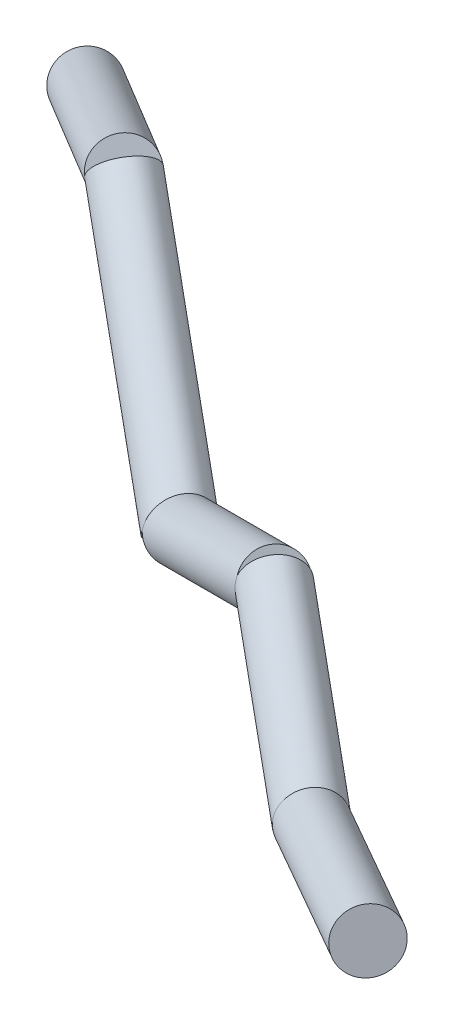
ISO-10303-21;
HEADER;
FILE_DESCRIPTION(('STEP AP214'),'2;1');
FILE_NAME('part.step','',(''),(''),'','','');
FILE_SCHEMA(('AUTOMOTIVE_DESIGN { 1 0 10303 214 1 1 1 1 }'));
ENDSEC;
DATA;
#1=APPLICATION_CONTEXT('core data for automotive mechanical design processes');
#2=APPLICATION_PROTOCOL_DEFINITION('international standard','automotive_design',2000,#1);
#3=PRODUCT_CONTEXT('',#1,'mechanical');
#4=PRODUCT('Part','Part','',(#3));
#5=PRODUCT_RELATED_PRODUCT_CATEGORY('part','',(#4));
#6=PRODUCT_DEFINITION_FORMATION('','',#4);
#7=PRODUCT_DEFINITION_CONTEXT('part definition',#1,'design');
#8=PRODUCT_DEFINITION('design','',#6,#7);
#9=PRODUCT_DEFINITION_SHAPE('','',#8);
#10=(LENGTH_UNIT() NAMED_UNIT(*) SI_UNIT(.MILLI.,.METRE.));
#11=(NAMED_UNIT(*) PLANE_ANGLE_UNIT() SI_UNIT($,.RADIAN.));
#12=(NAMED_UNIT(*) SI_UNIT($,.STERADIAN.) SOLID_ANGLE_UNIT());
#13=UNCERTAINTY_MEASURE_WITH_UNIT(LENGTH_MEASURE(1.E-05),#10,'distance_accuracy_value','');
#14=(GEOMETRIC_REPRESENTATION_CONTEXT(3) GLOBAL_UNCERTAINTY_ASSIGNED_CONTEXT((#13)) GLOBAL_UNIT_ASSIGNED_CONTEXT((#10,
#11,#12)) REPRESENTATION_CONTEXT('',''));
#15=CARTESIAN_POINT('',(0.,0.,0.));
#16=DIRECTION('',(0.,0.,1.));
#17=DIRECTION('',(1.,0.,0.));
#18=AXIS2_PLACEMENT_3D('',#15,#16,#17);
#19=CARTESIAN_POINT('',(0.,0.,0.));
#20=DIRECTION('',(0.727392967452922,0.363696483726961,0.581914373962938));
#21=DIRECTION('',(0.,-0.847998304005006,0.529998940003311));
#22=AXIS2_PLACEMENT_3D('',#19,#20,#21);
#23=PLANE('',#22);
#24=CARTESIAN_POINT('',(0.,0.,0.));
#25=DIRECTION('',(0.727392967453219,0.363696483726886,0.581914373962612));
#26=DIRECTION('',(0.665531499170195,-0.167234250415049,-0.727392967453213));
#27=AXIS2_PLACEMENT_3D('',#24,#25,#26);
#28=CIRCLE('',#27,15.);
#29=CARTESIAN_POINT('',(9.982972487552,-2.508513756224,-10.9108945118));
#30=VERTEX_POINT('',#29);
#31=EDGE_CURVE('E10',#30,#30,#28,.T.);
#32=ORIENTED_EDGE('',*,*,#31,.F.);
#33=EDGE_LOOP('',(#32));
#34=FACE_BOUND('',#33,.T.);
#35=ADVANCED_FACE('F16',(#34),#23,.F.);
#36=CARTESIAN_POINT('',(100.,50.,80.));
#37=DIRECTION('',(0.727392967452922,0.363696483726961,0.581914373962938));
#38=DIRECTION('',(0.,-0.847998304005006,0.529998940003311));
#39=AXIS2_PLACEMENT_3D('',#36,#37,#38);
#40=PLANE('',#39);
#41=DIRECTION('',(0.604727467440112,0.0610835825697213,-0.794086573406147));
#42=VECTOR('',#41,1.);
#43=CARTESIAN_POINT('',(100.,50.,80.));
#44=LINE('',#43,#42);
#45=CARTESIAN_POINT('',(90.929087988399,49.083746261454,91.911298601093));
#46=VERTEX_POINT('',#45);
#47=CARTESIAN_POINT('',(109.0709120116,50.916253738546,68.088701398907));
#48=VERTEX_POINT('',#47);
#49=EDGE_CURVE('E116',#46,#48,#44,.T.);
#50=ORIENTED_EDGE('',*,*,#49,.T.);
#51=CARTESIAN_POINT('',(100.,50.,80.));
#52=DIRECTION('',(0.727392967453219,0.363696483726886,0.581914373962612));
#53=DIRECTION('',(0.665531499170195,-0.167234250415049,-0.727392967453213));
#54=AXIS2_PLACEMENT_3D('',#51,#52,#53);
#55=CIRCLE('',#54,15.);
#56=EDGE_CURVE('E105',#48,#46,#55,.T.);
#57=ORIENTED_EDGE('',*,*,#56,.T.);
#58=EDGE_LOOP('',(#50,#57));
#59=FACE_BOUND('',#58,.T.);
#60=ADVANCED_FACE('F18',(#59),#40,.T.);
#61=CARTESIAN_POINT('',(0.,0.,0.));
#62=DIRECTION('',(0.727392967453219,0.363696483726886,0.581914373962612));
#63=DIRECTION('',(0.665531499170195,-0.167234250415049,-0.727392967453213));
#64=AXIS2_PLACEMENT_3D('',#61,#62,#63);
#65=CYLINDRICAL_SURFACE('',#64,15.);
#66=ORIENTED_EDGE('',*,*,#56,.F.);
#67=CARTESIAN_POINT('',(100.,50.,80.));
#68=DIRECTION('',(0.795105990127859,-0.103824697432432,0.597517277294859));
#69=DIRECTION('',(0.045947302274389,0.992718101045546,0.111353568735949));
#70=AXIS2_PLACEMENT_3D('',#67,#68,#69);
#71=ELLIPSE('',#70,16.886230430054,15.);
#72=CARTESIAN_POINT('',(108.60849765436,46.804248827181,67.989525621649));
#73=VERTEX_POINT('',#72);
#74=EDGE_CURVE('E109',#73,#48,#71,.T.);
#75=ORIENTED_EDGE('',*,*,#74,.F.);
#76=DIRECTION('',(0.727392967452922,0.363696483726961,0.581914373962938));
#77=VECTOR('',#76,1.);
#78=CARTESIAN_POINT('',(9.982972487552,-2.508513756224,-10.9108945118));
#79=LINE('',#78,#77);
#80=EDGE_CURVE('E25',#30,#73,#79,.T.);
#81=ORIENTED_EDGE('',*,*,#80,.F.);
#82=ORIENTED_EDGE('',*,*,#31,.T.);
#83=ORIENTED_EDGE('',*,*,#80,.T.);
#84=CARTESIAN_POINT('',(100.,50.,80.));
#85=DIRECTION('',(0.795105990127859,-0.103824697432432,0.597517277294859));
#86=DIRECTION('',(0.045947302274389,0.992718101045546,0.111353568735949));
#87=AXIS2_PLACEMENT_3D('',#84,#85,#86);
#88=ELLIPSE('',#87,16.886230430054,15.);
#89=EDGE_CURVE('E111',#46,#73,#88,.T.);
#90=ORIENTED_EDGE('',*,*,#89,.F.);
#91=EDGE_LOOP('',(#66,#75,#81,#82,#83,#90));
#92=FACE_BOUND('',#91,.T.);
#93=ADVANCED_FACE('F107',(#92),#65,.T.);
#94=CARTESIAN_POINT('',(100.,50.,80.));
#95=DIRECTION('',(0.685188709827879,-0.548150967861903,0.479632096878915));
#96=DIRECTION('',(0.,-0.658504607868324,-0.752576694707048));
#97=AXIS2_PLACEMENT_3D('',#94,#95,#96);
#98=PLANE('',#97);
#99=ORIENTED_EDGE('',*,*,#49,.F.);
#100=CARTESIAN_POINT('',(100.,50.,80.));
#101=DIRECTION('',(0.685188709827623,-0.548150967861999,0.479632096879173));
#102=DIRECTION('',(0.682702498096889,0.253838001521958,-0.685188709827888));
#103=AXIS2_PLACEMENT_3D('',#100,#101,#102);
#104=CIRCLE('',#103,15.);
#105=CARTESIAN_POINT('',(110.24053747145,53.807570022835,69.722169352587));
#106=VERTEX_POINT('',#105);
#107=EDGE_CURVE('E128',#106,#46,#104,.T.);
#108=ORIENTED_EDGE('',*,*,#107,.F.);
#109=CARTESIAN_POINT('',(100.,50.,80.));
#110=DIRECTION('',(0.685188709827623,-0.548150967861999,0.479632096879173));
#111=DIRECTION('',(0.682702498096889,0.253838001521958,-0.685188709827888));
#112=AXIS2_PLACEMENT_3D('',#109,#110,#111);
#113=CIRCLE('',#112,15.);
#114=EDGE_CURVE('E124',#48,#106,#113,.T.);
#115=ORIENTED_EDGE('',*,*,#114,.F.);
#116=EDGE_LOOP('',(#99,#108,#115));
#117=FACE_BOUND('',#116,.T.);
#118=ADVANCED_FACE('F127',(#117),#98,.F.);
#119=CARTESIAN_POINT('',(200.,-30.,150.));
#120=DIRECTION('',(0.685188709827879,-0.548150967861903,0.479632096878915));
#121=DIRECTION('',(0.,-0.658504607868324,-0.752576694707048));
#122=AXIS2_PLACEMENT_3D('',#119,#120,#121);
#123=PLANE('',#122);
#124=DIRECTION('',(-0.495343640012942,0.132091637336984,0.858595642688899));
#125=VECTOR('',#124,1.);
#126=CARTESIAN_POINT('',(200.,-30.,150.));
#127=LINE('',#126,#125);
#128=CARTESIAN_POINT('',(207.43015460019,-31.98137456005,137.12106535966));
#129=VERTEX_POINT('',#128);
#130=CARTESIAN_POINT('',(192.5698453998,-28.01862543994,162.87893464033));
#131=VERTEX_POINT('',#130);
#132=EDGE_CURVE('E132',#129,#131,#127,.T.);
#133=ORIENTED_EDGE('',*,*,#132,.T.);
#134=CARTESIAN_POINT('',(200.,-30.,150.));
#135=DIRECTION('',(0.685188709827623,-0.548150967861999,0.479632096879173));
#136=DIRECTION('',(0.682702498096889,0.253838001521958,-0.685188709827888));
#137=AXIS2_PLACEMENT_3D('',#134,#135,#136);
#138=CIRCLE('',#137,15.);
#139=EDGE_CURVE('E138',#131,#129,#138,.T.);
#140=ORIENTED_EDGE('',*,*,#139,.T.);
#141=EDGE_LOOP('',(#133,#140));
#142=FACE_BOUND('',#141,.T.);
#143=ADVANCED_FACE('F234',(#142),#123,.T.);
#144=CARTESIAN_POINT('',(100.,50.,80.));
#145=DIRECTION('',(0.685188709827623,-0.548150967861999,0.479632096879173));
#146=DIRECTION('',(0.682702498096889,0.253838001521958,-0.685188709827888));
#147=AXIS2_PLACEMENT_3D('',#144,#145,#146);
#148=CYLINDRICAL_SURFACE('',#147,15.);
#149=ORIENTED_EDGE('',*,*,#114,.T.);
#150=DIRECTION('',(0.685188709827879,-0.548150967861903,0.479632096878915));
#151=VECTOR('',#150,1.);
#152=CARTESIAN_POINT('',(110.24053747145,53.807570022835,69.722169352587));
#153=LINE('',#152,#151);
#154=CARTESIAN_POINT('',(207.68144376952,-24.14515501562,137.93080376123));
#155=VERTEX_POINT('',#154);
#156=EDGE_CURVE('E131',#106,#155,#153,.T.);
#157=ORIENTED_EDGE('',*,*,#156,.T.);
#158=CARTESIAN_POINT('',(200.,-30.,150.));
#159=DIRECTION('',(0.858041014444336,-0.0799383439243754,0.50732186893723));
#160=DIRECTION('',(-0.135647690101975,-0.988008937467816,0.0737430922440662));
#161=AXIS2_PLACEMENT_3D('',#158,#159,#160);
#162=ELLIPSE('',#161,17.141561279053,15.);
#163=EDGE_CURVE('E341',#129,#155,#162,.T.);
#164=ORIENTED_EDGE('',*,*,#163,.F.);
#165=ORIENTED_EDGE('',*,*,#139,.F.);
#166=CARTESIAN_POINT('',(200.,-30.,150.));
#167=DIRECTION('',(0.858041014444336,-0.0799383439243754,0.50732186893723));
#168=DIRECTION('',(-0.135647690101975,-0.988008937467816,0.0737430922440662));
#169=AXIS2_PLACEMENT_3D('',#166,#167,#168);
#170=ELLIPSE('',#169,17.141561279053,15.);
#171=EDGE_CURVE('E375',#155,#131,#170,.T.);
#172=ORIENTED_EDGE('',*,*,#171,.F.);
#173=ORIENTED_EDGE('',*,*,#156,.F.);
#174=ORIENTED_EDGE('',*,*,#107,.T.);
#175=ORIENTED_EDGE('',*,*,#89,.T.);
#176=ORIENTED_EDGE('',*,*,#74,.T.);
#177=EDGE_LOOP('',(#149,#157,#164,#165,#172,#173,#174,#175,#176));
#178=FACE_BOUND('',#177,.T.);
#179=ADVANCED_FACE('F123',(#178),#148,.T.);
#180=CARTESIAN_POINT('',(200.,-30.,150.));
#181=DIRECTION('',(0.816496580927726,0.408248290463863,0.408248290463863));
#182=DIRECTION('',(0.,0.707106781186548,-0.707106781186548));
#183=AXIS2_PLACEMENT_3D('',#180,#181,#182);
#184=PLANE('',#183);
#185=ORIENTED_EDGE('',*,*,#132,.F.);
#186=CARTESIAN_POINT('',(200.,-30.,150.));
#187=DIRECTION('',(0.816496580927726,0.408248290463863,0.408248290463863));
#188=DIRECTION('',(0.526598632370964,-0.236700683813984,-0.816496580927944));
#189=AXIS2_PLACEMENT_3D('',#186,#187,#188);
#190=CIRCLE('',#189,15.);
#191=CARTESIAN_POINT('',(207.89897948556,-33.55051025721,137.75255128608));
#192=VERTEX_POINT('',#191);
#193=EDGE_CURVE('E319',#192,#129,#190,.T.);
#194=ORIENTED_EDGE('',*,*,#193,.F.);
#195=CARTESIAN_POINT('',(200.,-30.,150.));
#196=DIRECTION('',(0.816496580927726,0.408248290463863,0.408248290463863));
#197=DIRECTION('',(0.526598632370964,-0.236700683813984,-0.816496580927944));
#198=AXIS2_PLACEMENT_3D('',#195,#196,#197);
#199=CIRCLE('',#198,15.);
#200=EDGE_CURVE('E310',#131,#192,#199,.T.);
#201=ORIENTED_EDGE('',*,*,#200,.F.);
#202=EDGE_LOOP('',(#185,#194,#201));
#203=FACE_BOUND('',#202,.T.);
#204=ADVANCED_FACE('F251',(#203),#184,.F.);
#205=CARTESIAN_POINT('',(300.,20.,200.));
#206=DIRECTION('',(0.816496580927726,0.408248290463863,0.408248290463863));
#207=DIRECTION('',(0.,0.707106781186548,-0.707106781186548));
#208=AXIS2_PLACEMENT_3D('',#205,#206,#207);
#209=PLANE('',#208);
#210=CARTESIAN_POINT('',(300.,20.,200.));
#211=DIRECTION('',(0.816496580927726,0.408248290463863,0.408248290463863));
#212=DIRECTION('',(0.526598632370964,-0.236700683813984,-0.816496580927944));
#213=AXIS2_PLACEMENT_3D('',#210,#211,#212);
#214=CIRCLE('',#213,15.);
#215=CARTESIAN_POINT('',(308.23231949922,15.060608300463,188.47475270108));
#216=VERTEX_POINT('',#215);
#217=CARTESIAN_POINT('',(307.89897948556,16.449489742783,187.75255128608));
#218=VERTEX_POINT('',#217);
#219=EDGE_CURVE('E141',#216,#218,#214,.T.);
#220=ORIENTED_EDGE('',*,*,#219,.T.);
#221=CARTESIAN_POINT('',(300.,20.,200.));
#222=DIRECTION('',(0.816496580927726,0.408248290463863,0.408248290463863));
#223=DIRECTION('',(0.526598632370964,-0.236700683813984,-0.816496580927944));
#224=AXIS2_PLACEMENT_3D('',#221,#222,#223);
#225=CIRCLE('',#224,15.);
#226=CARTESIAN_POINT('',(291.76768050077,24.939391699536,211.52524729891));
#227=VERTEX_POINT('',#226);
#228=EDGE_CURVE('E304',#218,#227,#225,.T.);
#229=ORIENTED_EDGE('',*,*,#228,.T.);
#230=DIRECTION('',(0.548821299948078,-0.329292779969047,-0.76834981992811));
#231=VECTOR('',#230,1.);
#232=CARTESIAN_POINT('',(300.,20.,200.));
#233=LINE('',#232,#231);
#234=EDGE_CURVE('E306',#227,#216,#233,.T.);
#235=ORIENTED_EDGE('',*,*,#234,.T.);
#236=EDGE_LOOP('',(#220,#229,#235));
#237=FACE_BOUND('',#236,.T.);
#238=ADVANCED_FACE('F206',(#237),#209,.T.);
#239=CARTESIAN_POINT('',(400.,0.,280.));
#240=DIRECTION('',(0.77151674981046,-0.154303349962092,0.617213399848368));
#241=DIRECTION('',(0.,-0.970142500145332,-0.242535625036333));
#242=AXIS2_PLACEMENT_3D('',#239,#240,#241);
#243=PLANE('',#242);
#244=DIRECTION('',(-0.597555190536099,0.157251365931026,0.786256829653131));
#245=VECTOR('',#244,1.);
#246=CARTESIAN_POINT('',(400.,0.,280.));
#247=LINE('',#246,#245);
#248=CARTESIAN_POINT('',(408.96332785804,-2.358770488958,268.2061475552));
#249=VERTEX_POINT('',#248);
#250=CARTESIAN_POINT('',(391.03667214195,2.358770488958,291.79385244479));
#251=VERTEX_POINT('',#250);
#252=EDGE_CURVE('E328',#249,#251,#247,.T.);
#253=ORIENTED_EDGE('',*,*,#252,.T.);
#254=CARTESIAN_POINT('',(400.,0.,280.));
#255=DIRECTION('',(0.771516749810115,-0.154303349962132,0.617213399848788));
#256=DIRECTION('',(0.631935961393089,0.0736128077214803,-0.771516749810108));
#257=AXIS2_PLACEMENT_3D('',#254,#255,#256);
#258=CIRCLE('',#257,15.);
#259=EDGE_CURVE('E351',#251,#249,#258,.T.);
#260=ORIENTED_EDGE('',*,*,#259,.T.);
#261=EDGE_LOOP('',(#253,#260));
#262=FACE_BOUND('',#261,.T.);
#263=ADVANCED_FACE('F201',(#262),#243,.T.);
#264=CARTESIAN_POINT('',(200.,-30.,150.));
#265=DIRECTION('',(0.816496580927726,0.408248290463863,0.408248290463863));
#266=DIRECTION('',(0.526598632370964,-0.236700683813984,-0.816496580927944));
#267=AXIS2_PLACEMENT_3D('',#264,#265,#266);
#268=CYLINDRICAL_SURFACE('',#267,15.);
#269=ORIENTED_EDGE('',*,*,#228,.F.);
#270=DIRECTION('',(0.816496580927726,0.408248290463863,0.408248290463863));
#271=VECTOR('',#270,1.);
#272=CARTESIAN_POINT('',(207.89897948556,-33.55051025721,137.75255128608));
#273=LINE('',#272,#271);
#274=EDGE_CURVE('E313',#192,#218,#273,.T.);
#275=ORIENTED_EDGE('',*,*,#274,.F.);
#276=ORIENTED_EDGE('',*,*,#193,.T.);
#277=ORIENTED_EDGE('',*,*,#163,.T.);
#278=ORIENTED_EDGE('',*,*,#171,.T.);
#279=ORIENTED_EDGE('',*,*,#200,.T.);
#280=ORIENTED_EDGE('',*,*,#274,.T.);
#281=ORIENTED_EDGE('',*,*,#219,.F.);
#282=CARTESIAN_POINT('',(300.,20.,200.));
#283=DIRECTION('',(0.832591524779573,0.133142714314574,0.537647068707878));
#284=DIRECTION('',(0.0747431173285436,0.93479371129967,-0.347237935321878));
#285=AXIS2_PLACEMENT_3D('',#282,#283,#284);
#286=ELLIPSE('',#285,15.728926993188,15.);
#287=EDGE_CURVE('E321',#227,#216,#286,.T.);
#288=ORIENTED_EDGE('',*,*,#287,.F.);
#289=EDGE_LOOP('',(#269,#275,#276,#277,#278,#279,#280,#281,#288));
#290=FACE_BOUND('',#289,.T.);
#291=ADVANCED_FACE('F185',(#290),#268,.T.);
#292=CARTESIAN_POINT('',(300.,20.,200.));
#293=DIRECTION('',(0.77151674981046,-0.154303349962092,0.617213399848368));
#294=DIRECTION('',(0.,-0.970142500145332,-0.242535625036333));
#295=AXIS2_PLACEMENT_3D('',#292,#293,#294);
#296=PLANE('',#295);
#297=ORIENTED_EDGE('',*,*,#234,.F.);
#298=CARTESIAN_POINT('',(300.,20.,200.));
#299=DIRECTION('',(0.771516749810115,-0.154303349962132,0.617213399848788));
#300=DIRECTION('',(0.631935961393089,0.0736128077214803,-0.771516749810108));
#301=AXIS2_PLACEMENT_3D('',#298,#299,#300);
#302=CIRCLE('',#301,15.);
#303=CARTESIAN_POINT('',(309.47903942089,21.104192115822,188.42724875284));
#304=VERTEX_POINT('',#303);
#305=EDGE_CURVE('E355',#304,#227,#302,.T.);
#306=ORIENTED_EDGE('',*,*,#305,.F.);
#307=CARTESIAN_POINT('',(300.,20.,200.));
#308=DIRECTION('',(0.771516749810115,-0.154303349962132,0.617213399848788));
#309=DIRECTION('',(0.631935961393089,0.0736128077214803,-0.771516749810108));
#310=AXIS2_PLACEMENT_3D('',#307,#308,#309);
#311=CIRCLE('',#310,15.);
#312=EDGE_CURVE('E363',#216,#304,#311,.T.);
#313=ORIENTED_EDGE('',*,*,#312,.F.);
#314=EDGE_LOOP('',(#297,#306,#313));
#315=FACE_BOUND('',#314,.T.);
#316=ADVANCED_FACE('F179',(#315),#296,.F.);
#317=CARTESIAN_POINT('',(500.,30.,350.));
#318=DIRECTION('',(0.795557284175781,0.238667185252934,0.556890098922847));
#319=DIRECTION('',(0.,-0.919145030017887,0.393919298579566));
#320=AXIS2_PLACEMENT_3D('',#317,#318,#319);
#321=PLANE('',#320);
#322=CARTESIAN_POINT('',(500.,30.,350.));
#323=DIRECTION('',(0.795557284175842,0.238667185252921,0.556890098922764));
#324=DIRECTION('',(0.593477154974988,-0.121956853506997,-0.795557284175984));
#325=AXIS2_PLACEMENT_3D('',#322,#323,#324);
#326=CIRCLE('',#325,15.);
#327=CARTESIAN_POINT('',(508.90215732462,28.170647197389,338.06664073736));
#328=VERTEX_POINT('',#327);
#329=EDGE_CURVE('E336',#328,#328,#326,.T.);
#330=ORIENTED_EDGE('',*,*,#329,.T.);
#331=EDGE_LOOP('',(#330));
#332=FACE_BOUND('',#331,.T.);
#333=ADVANCED_FACE('F184',(#332),#321,.T.);
#334=CARTESIAN_POINT('',(400.,0.,280.));
#335=DIRECTION('',(0.795557284175781,0.238667185252934,0.556890098922847));
#336=DIRECTION('',(0.,-0.919145030017887,0.393919298579566));
#337=AXIS2_PLACEMENT_3D('',#334,#335,#336);
#338=PLANE('',#337);
#339=CARTESIAN_POINT('',(400.,0.,280.));
#340=DIRECTION('',(0.795557284175842,0.238667185252921,0.556890098922764));
#341=DIRECTION('',(0.593477154974988,-0.121956853506997,-0.795557284175984));
#342=AXIS2_PLACEMENT_3D('',#339,#340,#341);
#343=CIRCLE('',#342,15.);
#344=EDGE_CURVE('E350',#251,#249,#343,.T.);
#345=ORIENTED_EDGE('',*,*,#344,.F.);
#346=ORIENTED_EDGE('',*,*,#252,.F.);
#347=EDGE_LOOP('',(#345,#346));
#348=FACE_BOUND('',#347,.T.);
#349=ADVANCED_FACE('F195',(#348),#338,.F.);
#350=CARTESIAN_POINT('',(300.,20.,200.));
#351=DIRECTION('',(0.771516749810115,-0.154303349962132,0.617213399848788));
#352=DIRECTION('',(0.631935961393089,0.0736128077214803,-0.771516749810108));
#353=AXIS2_PLACEMENT_3D('',#350,#351,#352);
#354=CYLINDRICAL_SURFACE('',#353,15.);
#355=ORIENTED_EDGE('',*,*,#312,.T.);
#356=DIRECTION('',(0.77151674981046,-0.154303349962092,0.617213399848368));
#357=VECTOR('',#356,1.);
#358=CARTESIAN_POINT('',(309.47903942089,21.104192115822,188.42724875284));
#359=LINE('',#358,#357);
#360=CARTESIAN_POINT('',(408.9327805738,1.21344388524,267.99024167517));
#361=VERTEX_POINT('',#360);
#362=EDGE_CURVE('E356',#304,#361,#359,.T.);
#363=ORIENTED_EDGE('',*,*,#362,.T.);
#364=CARTESIAN_POINT('',(400.,0.,280.));
#365=DIRECTION('',(0.79955282425866,0.0430441327650685,0.599051319883784));
#366=DIRECTION('',(-0.0603578949510396,-0.986620094335993,0.151452018703999));
#367=AXIS2_PLACEMENT_3D('',#364,#365,#366);
#368=ELLIPSE('',#367,15.306605946847,15.);
#369=CARTESIAN_POINT('',(408.99120774993,-1.80263767502,268.12897603507));
#370=VERTEX_POINT('',#369);
#371=EDGE_CURVE('E339',#370,#361,#368,.T.);
#372=ORIENTED_EDGE('',*,*,#371,.F.);
#373=CARTESIAN_POINT('',(400.,0.,280.));
#374=DIRECTION('',(0.79955282425866,0.0430441327650685,0.599051319883784));
#375=DIRECTION('',(-0.0603578949510396,-0.986620094335993,0.151452018703999));
#376=AXIS2_PLACEMENT_3D('',#373,#374,#375);
#377=ELLIPSE('',#376,15.306605946847,15.);
#378=EDGE_CURVE('E360',#249,#370,#377,.T.);
#379=ORIENTED_EDGE('',*,*,#378,.F.);
#380=ORIENTED_EDGE('',*,*,#259,.F.);
#381=CARTESIAN_POINT('',(400.,0.,280.));
#382=DIRECTION('',(0.79955282425866,0.0430441327650685,0.599051319883784));
#383=DIRECTION('',(-0.0603578949510396,-0.986620094335993,0.151452018703999));
#384=AXIS2_PLACEMENT_3D('',#381,#382,#383);
#385=ELLIPSE('',#384,15.306605946847,15.);
#386=EDGE_CURVE('E346',#361,#251,#385,.T.);
#387=ORIENTED_EDGE('',*,*,#386,.F.);
#388=ORIENTED_EDGE('',*,*,#362,.F.);
#389=ORIENTED_EDGE('',*,*,#305,.T.);
#390=ORIENTED_EDGE('',*,*,#287,.T.);
#391=EDGE_LOOP('',(#355,#363,#372,#379,#380,#387,#388,#389,#390));
#392=FACE_BOUND('',#391,.T.);
#393=ADVANCED_FACE('F163',(#392),#354,.T.);
#394=CARTESIAN_POINT('',(400.,0.,280.));
#395=DIRECTION('',(0.795557284175842,0.238667185252921,0.556890098922764));
#396=DIRECTION('',(0.593477154974988,-0.121956853506997,-0.795557284175984));
#397=AXIS2_PLACEMENT_3D('',#394,#395,#396);
#398=CYLINDRICAL_SURFACE('',#397,15.);
#399=DIRECTION('',(0.795557284175781,0.238667185252934,0.556890098922847));
#400=VECTOR('',#399,1.);
#401=CARTESIAN_POINT('',(408.90215732462,-1.829352802611,268.06664073736));
#402=LINE('',#401,#400);
#403=EDGE_CURVE('E332',#370,#328,#402,.T.);
#404=ORIENTED_EDGE('',*,*,#403,.T.);
#405=ORIENTED_EDGE('',*,*,#329,.F.);
#406=ORIENTED_EDGE('',*,*,#403,.F.);
#407=ORIENTED_EDGE('',*,*,#371,.T.);
#408=ORIENTED_EDGE('',*,*,#386,.T.);
#409=ORIENTED_EDGE('',*,*,#344,.T.);
#410=ORIENTED_EDGE('',*,*,#378,.T.);
#411=EDGE_LOOP('',(#404,#405,#406,#407,#408,#409,#410));
#412=FACE_BOUND('',#411,.T.);
#413=ADVANCED_FACE('F158',(#412),#398,.T.);
#414=CLOSED_SHELL('',(#35,#60,#93,#118,#143,#179,#204,#238,#263,#291,#316,#333,#349,#393,#413));
#415=MANIFOLD_SOLID_BREP('B1',#414);
#416=ADVANCED_BREP_SHAPE_REPRESENTATION('',(#18,#415),#14);
#417=SHAPE_DEFINITION_REPRESENTATION(#9,#416);
ENDSEC;
END-ISO-10303-21;
